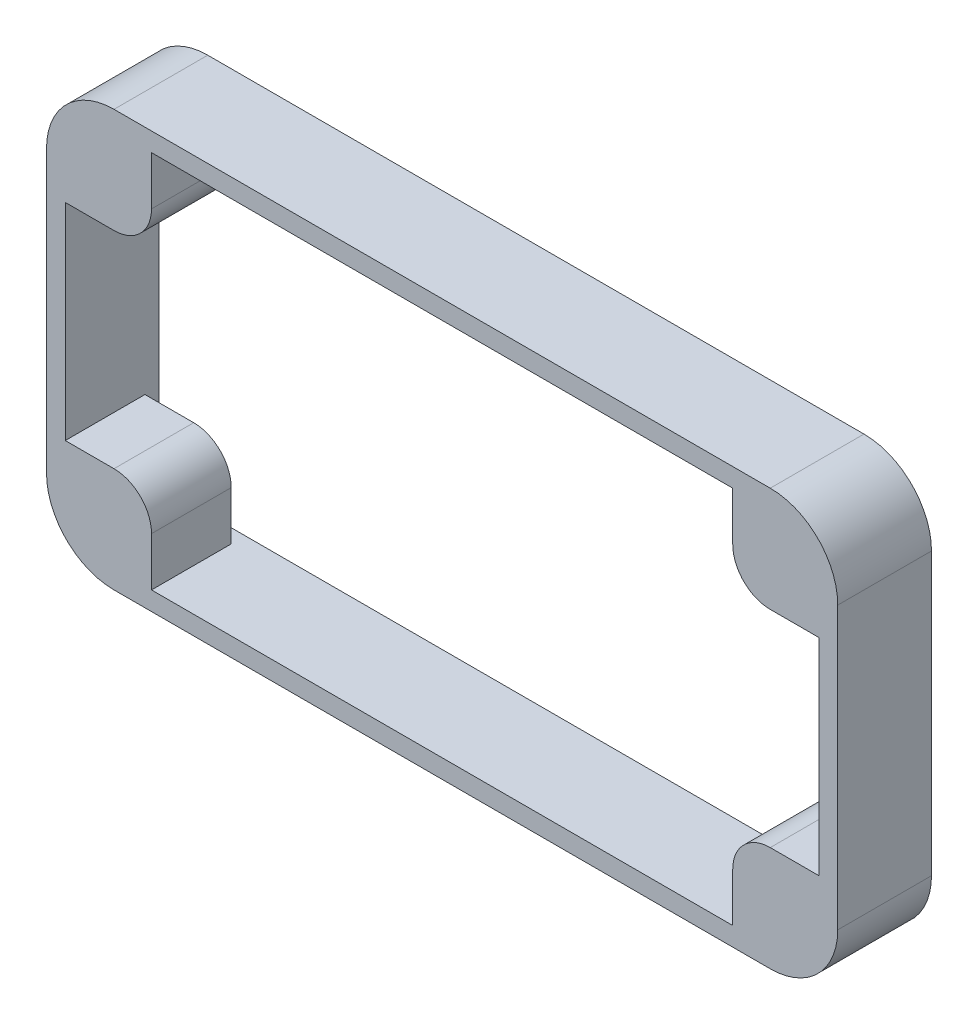
ISO-10303-21;
HEADER;
FILE_DESCRIPTION(('STEP AP214'),'2;1');
FILE_NAME('part.step','',(''),(''),'','','');
FILE_SCHEMA(('AUTOMOTIVE_DESIGN { 1 0 10303 214 1 1 1 1 }'));
ENDSEC;
DATA;
#1=APPLICATION_CONTEXT('core data for automotive mechanical design processes');
#2=APPLICATION_PROTOCOL_DEFINITION('international standard','automotive_design',2000,#1);
#3=PRODUCT_CONTEXT('',#1,'mechanical');
#4=PRODUCT('Part','Part','',(#3));
#5=PRODUCT_RELATED_PRODUCT_CATEGORY('part','',(#4));
#6=PRODUCT_DEFINITION_FORMATION('','',#4);
#7=PRODUCT_DEFINITION_CONTEXT('part definition',#1,'design');
#8=PRODUCT_DEFINITION('design','',#6,#7);
#9=PRODUCT_DEFINITION_SHAPE('','',#8);
#10=(LENGTH_UNIT() NAMED_UNIT(*) SI_UNIT(.MILLI.,.METRE.));
#11=(NAMED_UNIT(*) PLANE_ANGLE_UNIT() SI_UNIT($,.RADIAN.));
#12=(NAMED_UNIT(*) SI_UNIT($,.STERADIAN.) SOLID_ANGLE_UNIT());
#13=UNCERTAINTY_MEASURE_WITH_UNIT(LENGTH_MEASURE(1.E-05),#10,'distance_accuracy_value','');
#14=(GEOMETRIC_REPRESENTATION_CONTEXT(3) GLOBAL_UNCERTAINTY_ASSIGNED_CONTEXT((#13)) GLOBAL_UNIT_ASSIGNED_CONTEXT((#10,
#11,#12)) REPRESENTATION_CONTEXT('',''));
#15=CARTESIAN_POINT('',(0.,0.,0.));
#16=DIRECTION('',(0.,0.,1.));
#17=DIRECTION('',(1.,0.,0.));
#18=AXIS2_PLACEMENT_3D('',#15,#16,#17);
#19=CARTESIAN_POINT('',(-35.,-15.,10.));
#20=DIRECTION('',(0.,0.,-1.));
#21=DIRECTION('',(-1.,0.,0.));
#22=AXIS2_PLACEMENT_3D('',#19,#20,#21);
#23=CYLINDRICAL_SURFACE('',#22,5.20000000000001);
#24=DIRECTION('',(0.,0.,-1.));
#25=VECTOR('',#24,1.);
#26=CARTESIAN_POINT('',(-40.2,-15.,10.));
#27=LINE('',#26,#25);
#28=CARTESIAN_POINT('',(-40.2,-15.,1.5));
#29=VERTEX_POINT('',#28);
#30=CARTESIAN_POINT('',(-40.2,-15.,0.));
#31=VERTEX_POINT('',#30);
#32=EDGE_CURVE('E323',#29,#31,#27,.T.);
#33=ORIENTED_EDGE('',*,*,#32,.F.);
#34=CARTESIAN_POINT('',(-35.,-15.,1.5));
#35=DIRECTION('',(0.,0.,-1.));
#36=DIRECTION('',(1.,0.,0.));
#37=AXIS2_PLACEMENT_3D('',#34,#35,#36);
#38=CIRCLE('',#37,5.2);
#39=CARTESIAN_POINT('',(-35.,-20.2,1.5));
#40=VERTEX_POINT('',#39);
#41=EDGE_CURVE('E870',#40,#29,#38,.T.);
#42=ORIENTED_EDGE('',*,*,#41,.F.);
#43=DIRECTION('',(0.,0.,-1.));
#44=VECTOR('',#43,1.);
#45=CARTESIAN_POINT('',(-35.,-20.2,10.));
#46=LINE('',#45,#44);
#47=CARTESIAN_POINT('',(-35.,-20.2,0.));
#48=VERTEX_POINT('',#47);
#49=EDGE_CURVE('E321',#40,#48,#46,.T.);
#50=ORIENTED_EDGE('',*,*,#49,.T.);
#51=CARTESIAN_POINT('',(-35.,-15.,0.));
#52=DIRECTION('',(0.,0.,1.));
#53=DIRECTION('',(-1.,0.,0.));
#54=AXIS2_PLACEMENT_3D('',#51,#52,#53);
#55=CIRCLE('',#54,5.20000000000001);
#56=EDGE_CURVE('E298',#31,#48,#55,.T.);
#57=ORIENTED_EDGE('',*,*,#56,.F.);
#58=EDGE_LOOP('',(#33,#42,#50,#57));
#59=FACE_BOUND('',#58,.T.);
#60=ADVANCED_FACE('F35',(#59),#23,.F.);
#61=CARTESIAN_POINT('',(35.,-15.,10.));
#62=DIRECTION('',(0.,0.,-1.));
#63=DIRECTION('',(-1.,0.,0.));
#64=AXIS2_PLACEMENT_3D('',#61,#62,#63);
#65=CYLINDRICAL_SURFACE('',#64,5.2);
#66=DIRECTION('',(0.,0.,-1.));
#67=VECTOR('',#66,1.);
#68=CARTESIAN_POINT('',(35.,-20.2,10.));
#69=LINE('',#68,#67);
#70=CARTESIAN_POINT('',(35.,-20.2,1.5));
#71=VERTEX_POINT('',#70);
#72=CARTESIAN_POINT('',(35.,-20.2,0.));
#73=VERTEX_POINT('',#72);
#74=EDGE_CURVE('E319',#71,#73,#69,.T.);
#75=ORIENTED_EDGE('',*,*,#74,.F.);
#76=CARTESIAN_POINT('',(35.,-15.,1.5));
#77=DIRECTION('',(0.,0.,-1.));
#78=DIRECTION('',(-1.,0.,0.));
#79=AXIS2_PLACEMENT_3D('',#76,#77,#78);
#80=CIRCLE('',#79,5.2);
#81=CARTESIAN_POINT('',(40.2,-15.,1.5));
#82=VERTEX_POINT('',#81);
#83=EDGE_CURVE('E845',#82,#71,#80,.T.);
#84=ORIENTED_EDGE('',*,*,#83,.F.);
#85=DIRECTION('',(0.,0.,-1.));
#86=VECTOR('',#85,1.);
#87=CARTESIAN_POINT('',(40.2,-15.,10.));
#88=LINE('',#87,#86);
#89=CARTESIAN_POINT('',(40.2,-15.,0.));
#90=VERTEX_POINT('',#89);
#91=EDGE_CURVE('E317',#82,#90,#88,.T.);
#92=ORIENTED_EDGE('',*,*,#91,.T.);
#93=CARTESIAN_POINT('',(35.,-15.,0.));
#94=DIRECTION('',(0.,0.,1.));
#95=DIRECTION('',(-1.,0.,0.));
#96=AXIS2_PLACEMENT_3D('',#93,#94,#95);
#97=CIRCLE('',#96,5.2);
#98=EDGE_CURVE('E304',#73,#90,#97,.T.);
#99=ORIENTED_EDGE('',*,*,#98,.F.);
#100=EDGE_LOOP('',(#75,#84,#92,#99));
#101=FACE_BOUND('',#100,.T.);
#102=ADVANCED_FACE('F428',(#101),#65,.F.);
#103=CARTESIAN_POINT('',(35.,15.,10.));
#104=DIRECTION('',(0.,0.,-1.));
#105=DIRECTION('',(-1.,0.,0.));
#106=AXIS2_PLACEMENT_3D('',#103,#104,#105);
#107=CYLINDRICAL_SURFACE('',#106,5.2);
#108=DIRECTION('',(0.,0.,-1.));
#109=VECTOR('',#108,1.);
#110=CARTESIAN_POINT('',(40.2,15.,10.));
#111=LINE('',#110,#109);
#112=CARTESIAN_POINT('',(40.2,15.,1.5));
#113=VERTEX_POINT('',#112);
#114=CARTESIAN_POINT('',(40.2,15.,0.));
#115=VERTEX_POINT('',#114);
#116=EDGE_CURVE('E315',#113,#115,#111,.T.);
#117=ORIENTED_EDGE('',*,*,#116,.F.);
#118=CARTESIAN_POINT('',(35.,15.,1.5));
#119=DIRECTION('',(0.,0.,-1.));
#120=DIRECTION('',(1.,0.,0.));
#121=AXIS2_PLACEMENT_3D('',#118,#119,#120);
#122=CIRCLE('',#121,5.2);
#123=CARTESIAN_POINT('',(35.,20.2,1.5));
#124=VERTEX_POINT('',#123);
#125=EDGE_CURVE('E746',#124,#113,#122,.T.);
#126=ORIENTED_EDGE('',*,*,#125,.F.);
#127=DIRECTION('',(0.,0.,-1.));
#128=VECTOR('',#127,1.);
#129=CARTESIAN_POINT('',(35.,20.2,10.));
#130=LINE('',#129,#128);
#131=CARTESIAN_POINT('',(35.,20.2,0.));
#132=VERTEX_POINT('',#131);
#133=EDGE_CURVE('E313',#124,#132,#130,.T.);
#134=ORIENTED_EDGE('',*,*,#133,.T.);
#135=CARTESIAN_POINT('',(35.,15.,0.));
#136=DIRECTION('',(0.,0.,1.));
#137=DIRECTION('',(-1.,0.,0.));
#138=AXIS2_PLACEMENT_3D('',#135,#136,#137);
#139=CIRCLE('',#138,5.2);
#140=EDGE_CURVE('E281',#115,#132,#139,.T.);
#141=ORIENTED_EDGE('',*,*,#140,.F.);
#142=EDGE_LOOP('',(#117,#126,#134,#141));
#143=FACE_BOUND('',#142,.T.);
#144=ADVANCED_FACE('F434',(#143),#107,.F.);
#145=CARTESIAN_POINT('',(-35.,15.,10.));
#146=DIRECTION('',(0.,0.,-1.));
#147=DIRECTION('',(-1.,0.,0.));
#148=AXIS2_PLACEMENT_3D('',#145,#146,#147);
#149=CYLINDRICAL_SURFACE('',#148,5.2);
#150=DIRECTION('',(0.,0.,-1.));
#151=VECTOR('',#150,1.);
#152=CARTESIAN_POINT('',(-35.,20.2,10.));
#153=LINE('',#152,#151);
#154=CARTESIAN_POINT('',(-35.,20.2,1.5));
#155=VERTEX_POINT('',#154);
#156=CARTESIAN_POINT('',(-35.,20.2,0.));
#157=VERTEX_POINT('',#156);
#158=EDGE_CURVE('E290',#155,#157,#153,.T.);
#159=ORIENTED_EDGE('',*,*,#158,.F.);
#160=CARTESIAN_POINT('',(-35.,15.,1.5));
#161=DIRECTION('',(0.,0.,-1.));
#162=DIRECTION('',(-1.,0.,0.));
#163=AXIS2_PLACEMENT_3D('',#160,#161,#162);
#164=CIRCLE('',#163,5.2);
#165=CARTESIAN_POINT('',(-40.2,15.,1.5));
#166=VERTEX_POINT('',#165);
#167=EDGE_CURVE('E799',#166,#155,#164,.T.);
#168=ORIENTED_EDGE('',*,*,#167,.F.);
#169=DIRECTION('',(0.,0.,-1.));
#170=VECTOR('',#169,1.);
#171=CARTESIAN_POINT('',(-40.2,15.,10.));
#172=LINE('',#171,#170);
#173=CARTESIAN_POINT('',(-40.2,15.,0.));
#174=VERTEX_POINT('',#173);
#175=EDGE_CURVE('E325',#166,#174,#172,.T.);
#176=ORIENTED_EDGE('',*,*,#175,.T.);
#177=CARTESIAN_POINT('',(-35.,15.,0.));
#178=DIRECTION('',(0.,0.,1.));
#179=DIRECTION('',(1.,0.,0.));
#180=AXIS2_PLACEMENT_3D('',#177,#178,#179);
#181=CIRCLE('',#180,5.2);
#182=EDGE_CURVE('E291',#157,#174,#181,.T.);
#183=ORIENTED_EDGE('',*,*,#182,.F.);
#184=EDGE_LOOP('',(#159,#168,#176,#183));
#185=FACE_BOUND('',#184,.T.);
#186=ADVANCED_FACE('F443',(#185),#149,.F.);
#187=CARTESIAN_POINT('',(-35.,15.,10.));
#188=DIRECTION('',(0.,0.,1.));
#189=DIRECTION('',(1.,0.,0.));
#190=AXIS2_PLACEMENT_3D('',#187,#188,#189);
#191=PLANE('',#190);
#192=DIRECTION('',(1.,0.,0.));
#193=VECTOR('',#192,1.);
#194=CARTESIAN_POINT('',(-35.,-11.,10.));
#195=LINE('',#194,#193);
#196=CARTESIAN_POINT('',(-40.2,-11.,10.));
#197=VERTEX_POINT('',#196);
#198=CARTESIAN_POINT('',(-35.,-11.,10.));
#199=VERTEX_POINT('',#198);
#200=EDGE_CURVE('E249',#197,#199,#195,.T.);
#201=ORIENTED_EDGE('',*,*,#200,.F.);
#202=DIRECTION('',(0.,-1.,0.));
#203=VECTOR('',#202,1.);
#204=CARTESIAN_POINT('',(-40.2,-15.,10.));
#205=LINE('',#204,#203);
#206=CARTESIAN_POINT('',(-40.2,11.,10.));
#207=VERTEX_POINT('',#206);
#208=EDGE_CURVE('E265',#207,#197,#205,.T.);
#209=ORIENTED_EDGE('',*,*,#208,.F.);
#210=DIRECTION('',(-1.,0.,0.));
#211=VECTOR('',#210,1.);
#212=CARTESIAN_POINT('',(-35.,11.,10.));
#213=LINE('',#212,#211);
#214=CARTESIAN_POINT('',(-35.,11.,10.));
#215=VERTEX_POINT('',#214);
#216=EDGE_CURVE('E786',#215,#207,#213,.T.);
#217=ORIENTED_EDGE('',*,*,#216,.F.);
#218=CARTESIAN_POINT('',(-35.,15.,10.));
#219=DIRECTION('',(0.,0.,-1.));
#220=DIRECTION('',(1.,0.,0.));
#221=AXIS2_PLACEMENT_3D('',#218,#219,#220);
#222=CIRCLE('',#221,4.);
#223=CARTESIAN_POINT('',(-31.,15.,10.));
#224=VERTEX_POINT('',#223);
#225=EDGE_CURVE('E783',#224,#215,#222,.T.);
#226=ORIENTED_EDGE('',*,*,#225,.F.);
#227=DIRECTION('',(0.,-1.,0.));
#228=VECTOR('',#227,1.);
#229=CARTESIAN_POINT('',(-31.,15.,10.));
#230=LINE('',#229,#228);
#231=CARTESIAN_POINT('',(-31.,20.2,10.));
#232=VERTEX_POINT('',#231);
#233=EDGE_CURVE('E789',#232,#224,#230,.T.);
#234=ORIENTED_EDGE('',*,*,#233,.F.);
#235=DIRECTION('',(-1.,0.,0.));
#236=VECTOR('',#235,1.);
#237=CARTESIAN_POINT('',(-35.,20.2,10.));
#238=LINE('',#237,#236);
#239=CARTESIAN_POINT('',(31.,20.2,10.));
#240=VERTEX_POINT('',#239);
#241=EDGE_CURVE('E288',#240,#232,#238,.T.);
#242=ORIENTED_EDGE('',*,*,#241,.F.);
#243=DIRECTION('',(0.,1.,0.));
#244=VECTOR('',#243,1.);
#245=CARTESIAN_POINT('',(31.,15.,10.));
#246=LINE('',#245,#244);
#247=CARTESIAN_POINT('',(31.,15.,10.));
#248=VERTEX_POINT('',#247);
#249=EDGE_CURVE('E782',#248,#240,#246,.T.);
#250=ORIENTED_EDGE('',*,*,#249,.F.);
#251=CARTESIAN_POINT('',(35.,15.,10.));
#252=DIRECTION('',(0.,0.,-1.));
#253=DIRECTION('',(-1.,0.,0.));
#254=AXIS2_PLACEMENT_3D('',#251,#252,#253);
#255=CIRCLE('',#254,4.);
#256=CARTESIAN_POINT('',(35.,11.,10.));
#257=VERTEX_POINT('',#256);
#258=EDGE_CURVE('E823',#257,#248,#255,.T.);
#259=ORIENTED_EDGE('',*,*,#258,.F.);
#260=DIRECTION('',(-1.,0.,0.));
#261=VECTOR('',#260,1.);
#262=CARTESIAN_POINT('',(35.,11.,10.));
#263=LINE('',#262,#261);
#264=CARTESIAN_POINT('',(40.2,11.,10.));
#265=VERTEX_POINT('',#264);
#266=EDGE_CURVE('E772',#265,#257,#263,.T.);
#267=ORIENTED_EDGE('',*,*,#266,.F.);
#268=DIRECTION('',(0.,1.,0.));
#269=VECTOR('',#268,1.);
#270=CARTESIAN_POINT('',(40.2,15.,10.));
#271=LINE('',#270,#269);
#272=CARTESIAN_POINT('',(40.2,-11.,10.));
#273=VERTEX_POINT('',#272);
#274=EDGE_CURVE('E278',#273,#265,#271,.T.);
#275=ORIENTED_EDGE('',*,*,#274,.F.);
#276=DIRECTION('',(1.,0.,0.));
#277=VECTOR('',#276,1.);
#278=CARTESIAN_POINT('',(35.,-11.,10.));
#279=LINE('',#278,#277);
#280=CARTESIAN_POINT('',(35.,-11.,10.));
#281=VERTEX_POINT('',#280);
#282=EDGE_CURVE('E855',#281,#273,#279,.T.);
#283=ORIENTED_EDGE('',*,*,#282,.F.);
#284=CARTESIAN_POINT('',(35.,-15.,10.));
#285=DIRECTION('',(0.,0.,-1.));
#286=DIRECTION('',(1.,0.,0.));
#287=AXIS2_PLACEMENT_3D('',#284,#285,#286);
#288=CIRCLE('',#287,4.);
#289=CARTESIAN_POINT('',(31.,-15.,10.));
#290=VERTEX_POINT('',#289);
#291=EDGE_CURVE('E842',#290,#281,#288,.T.);
#292=ORIENTED_EDGE('',*,*,#291,.F.);
#293=DIRECTION('',(0.,1.,0.));
#294=VECTOR('',#293,1.);
#295=CARTESIAN_POINT('',(31.,-15.,10.));
#296=LINE('',#295,#294);
#297=CARTESIAN_POINT('',(31.,-20.2,10.));
#298=VERTEX_POINT('',#297);
#299=EDGE_CURVE('E833',#298,#290,#296,.T.);
#300=ORIENTED_EDGE('',*,*,#299,.F.);
#301=DIRECTION('',(1.,0.,0.));
#302=VECTOR('',#301,1.);
#303=CARTESIAN_POINT('',(35.,-20.2,10.));
#304=LINE('',#303,#302);
#305=CARTESIAN_POINT('',(-31.,-20.2,10.));
#306=VERTEX_POINT('',#305);
#307=EDGE_CURVE('E275',#306,#298,#304,.T.);
#308=ORIENTED_EDGE('',*,*,#307,.F.);
#309=DIRECTION('',(0.,-1.,0.));
#310=VECTOR('',#309,1.);
#311=CARTESIAN_POINT('',(-31.,-15.,10.));
#312=LINE('',#311,#310);
#313=CARTESIAN_POINT('',(-31.,-15.,10.));
#314=VERTEX_POINT('',#313);
#315=EDGE_CURVE('E257',#314,#306,#312,.T.);
#316=ORIENTED_EDGE('',*,*,#315,.F.);
#317=CARTESIAN_POINT('',(-35.,-15.,10.));
#318=DIRECTION('',(0.,0.,-1.));
#319=DIRECTION('',(-1.,0.,0.));
#320=AXIS2_PLACEMENT_3D('',#317,#318,#319);
#321=CIRCLE('',#320,3.99999999999999);
#322=EDGE_CURVE('E268',#199,#314,#321,.T.);
#323=ORIENTED_EDGE('',*,*,#322,.F.);
#324=EDGE_LOOP('',(#201,#209,#217,#226,#234,#242,#250,#259,#267,#275,#283,#292,#300,#308,#316,#323));
#325=FACE_BOUND('',#324,.T.);
#326=CARTESIAN_POINT('',(-35.,15.,10.));
#327=DIRECTION('',(0.,0.,1.));
#328=DIRECTION('',(1.,0.,0.));
#329=AXIS2_PLACEMENT_3D('',#326,#327,#328);
#330=CIRCLE('',#329,7.2);
#331=CARTESIAN_POINT('',(-35.,22.2,10.));
#332=VERTEX_POINT('',#331);
#333=CARTESIAN_POINT('',(-42.2,15.,10.));
#334=VERTEX_POINT('',#333);
#335=EDGE_CURVE('E328',#332,#334,#330,.T.);
#336=ORIENTED_EDGE('',*,*,#335,.T.);
#337=DIRECTION('',(0.,-1.,0.));
#338=VECTOR('',#337,1.);
#339=CARTESIAN_POINT('',(-42.2,-15.,10.));
#340=LINE('',#339,#338);
#341=CARTESIAN_POINT('',(-42.2,-15.,10.));
#342=VERTEX_POINT('',#341);
#343=EDGE_CURVE('E331',#334,#342,#340,.T.);
#344=ORIENTED_EDGE('',*,*,#343,.T.);
#345=CARTESIAN_POINT('',(-35.,-15.,10.));
#346=DIRECTION('',(0.,0.,1.));
#347=DIRECTION('',(-1.,0.,0.));
#348=AXIS2_PLACEMENT_3D('',#345,#346,#347);
#349=CIRCLE('',#348,7.20000000000001);
#350=CARTESIAN_POINT('',(-35.,-22.2,10.));
#351=VERTEX_POINT('',#350);
#352=EDGE_CURVE('E334',#342,#351,#349,.T.);
#353=ORIENTED_EDGE('',*,*,#352,.T.);
#354=DIRECTION('',(1.,0.,0.));
#355=VECTOR('',#354,1.);
#356=CARTESIAN_POINT('',(35.,-22.2,10.));
#357=LINE('',#356,#355);
#358=CARTESIAN_POINT('',(35.,-22.2,10.));
#359=VERTEX_POINT('',#358);
#360=EDGE_CURVE('E336',#351,#359,#357,.T.);
#361=ORIENTED_EDGE('',*,*,#360,.T.);
#362=CARTESIAN_POINT('',(35.,-15.,10.));
#363=DIRECTION('',(0.,0.,1.));
#364=DIRECTION('',(-1.,0.,0.));
#365=AXIS2_PLACEMENT_3D('',#362,#363,#364);
#366=CIRCLE('',#365,7.20000000000001);
#367=CARTESIAN_POINT('',(42.2,-15.,10.));
#368=VERTEX_POINT('',#367);
#369=EDGE_CURVE('E338',#359,#368,#366,.T.);
#370=ORIENTED_EDGE('',*,*,#369,.T.);
#371=DIRECTION('',(0.,1.,0.));
#372=VECTOR('',#371,1.);
#373=CARTESIAN_POINT('',(42.2,15.,10.));
#374=LINE('',#373,#372);
#375=CARTESIAN_POINT('',(42.2,15.,10.));
#376=VERTEX_POINT('',#375);
#377=EDGE_CURVE('E340',#368,#376,#374,.T.);
#378=ORIENTED_EDGE('',*,*,#377,.T.);
#379=CARTESIAN_POINT('',(35.,15.,10.));
#380=DIRECTION('',(0.,0.,1.));
#381=DIRECTION('',(-1.,0.,0.));
#382=AXIS2_PLACEMENT_3D('',#379,#380,#381);
#383=CIRCLE('',#382,7.2);
#384=CARTESIAN_POINT('',(35.,22.2,10.));
#385=VERTEX_POINT('',#384);
#386=EDGE_CURVE('E342',#376,#385,#383,.T.);
#387=ORIENTED_EDGE('',*,*,#386,.T.);
#388=DIRECTION('',(-1.,0.,0.));
#389=VECTOR('',#388,1.);
#390=CARTESIAN_POINT('',(-35.,22.2,10.));
#391=LINE('',#390,#389);
#392=EDGE_CURVE('E344',#385,#332,#391,.T.);
#393=ORIENTED_EDGE('',*,*,#392,.T.);
#394=EDGE_LOOP('',(#336,#344,#353,#361,#370,#378,#387,#393));
#395=FACE_BOUND('',#394,.T.);
#396=ADVANCED_FACE('F262',(#325,#395),#191,.T.);
#397=CARTESIAN_POINT('',(-35.,15.,0.));
#398=DIRECTION('',(0.,0.,1.));
#399=DIRECTION('',(1.,0.,0.));
#400=AXIS2_PLACEMENT_3D('',#397,#398,#399);
#401=PLANE('',#400);
#402=CARTESIAN_POINT('',(-35.,15.,0.));
#403=DIRECTION('',(0.,0.,1.));
#404=DIRECTION('',(1.,0.,0.));
#405=AXIS2_PLACEMENT_3D('',#402,#403,#404);
#406=CIRCLE('',#405,7.2);
#407=CARTESIAN_POINT('',(-35.,22.2,0.));
#408=VERTEX_POINT('',#407);
#409=CARTESIAN_POINT('',(-42.2,15.,0.));
#410=VERTEX_POINT('',#409);
#411=EDGE_CURVE('E327',#408,#410,#406,.T.);
#412=ORIENTED_EDGE('',*,*,#411,.F.);
#413=DIRECTION('',(-1.,0.,0.));
#414=VECTOR('',#413,1.);
#415=CARTESIAN_POINT('',(-35.,22.2,0.));
#416=LINE('',#415,#414);
#417=CARTESIAN_POINT('',(35.,22.2,0.));
#418=VERTEX_POINT('',#417);
#419=EDGE_CURVE('E332',#418,#408,#416,.T.);
#420=ORIENTED_EDGE('',*,*,#419,.F.);
#421=CARTESIAN_POINT('',(35.,15.,0.));
#422=DIRECTION('',(0.,0.,1.));
#423=DIRECTION('',(-1.,0.,0.));
#424=AXIS2_PLACEMENT_3D('',#421,#422,#423);
#425=CIRCLE('',#424,7.2);
#426=CARTESIAN_POINT('',(42.2,15.,0.));
#427=VERTEX_POINT('',#426);
#428=EDGE_CURVE('E359',#427,#418,#425,.T.);
#429=ORIENTED_EDGE('',*,*,#428,.F.);
#430=DIRECTION('',(0.,1.,0.));
#431=VECTOR('',#430,1.);
#432=CARTESIAN_POINT('',(42.2,15.,0.));
#433=LINE('',#432,#431);
#434=CARTESIAN_POINT('',(42.2,-15.,0.));
#435=VERTEX_POINT('',#434);
#436=EDGE_CURVE('E357',#435,#427,#433,.T.);
#437=ORIENTED_EDGE('',*,*,#436,.F.);
#438=CARTESIAN_POINT('',(35.,-15.,0.));
#439=DIRECTION('',(0.,0.,1.));
#440=DIRECTION('',(-1.,0.,0.));
#441=AXIS2_PLACEMENT_3D('',#438,#439,#440);
#442=CIRCLE('',#441,7.20000000000001);
#443=CARTESIAN_POINT('',(35.,-22.2,0.));
#444=VERTEX_POINT('',#443);
#445=EDGE_CURVE('E355',#444,#435,#442,.T.);
#446=ORIENTED_EDGE('',*,*,#445,.F.);
#447=DIRECTION('',(1.,0.,0.));
#448=VECTOR('',#447,1.);
#449=CARTESIAN_POINT('',(35.,-22.2,0.));
#450=LINE('',#449,#448);
#451=CARTESIAN_POINT('',(-35.,-22.2,0.));
#452=VERTEX_POINT('',#451);
#453=EDGE_CURVE('E353',#452,#444,#450,.T.);
#454=ORIENTED_EDGE('',*,*,#453,.F.);
#455=CARTESIAN_POINT('',(-35.,-15.,0.));
#456=DIRECTION('',(0.,0.,1.));
#457=DIRECTION('',(-1.,0.,0.));
#458=AXIS2_PLACEMENT_3D('',#455,#456,#457);
#459=CIRCLE('',#458,7.20000000000001);
#460=CARTESIAN_POINT('',(-42.2,-15.,0.));
#461=VERTEX_POINT('',#460);
#462=EDGE_CURVE('E351',#461,#452,#459,.T.);
#463=ORIENTED_EDGE('',*,*,#462,.F.);
#464=DIRECTION('',(0.,-1.,0.));
#465=VECTOR('',#464,1.);
#466=CARTESIAN_POINT('',(-42.2,-15.,0.));
#467=LINE('',#466,#465);
#468=EDGE_CURVE('E349',#410,#461,#467,.T.);
#469=ORIENTED_EDGE('',*,*,#468,.F.);
#470=EDGE_LOOP('',(#412,#420,#429,#437,#446,#454,#463,#469));
#471=FACE_BOUND('',#470,.T.);
#472=ORIENTED_EDGE('',*,*,#182,.T.);
#473=DIRECTION('',(0.,-1.,0.));
#474=VECTOR('',#473,1.);
#475=CARTESIAN_POINT('',(-40.2,-15.,0.));
#476=LINE('',#475,#474);
#477=EDGE_CURVE('E294',#174,#31,#476,.T.);
#478=ORIENTED_EDGE('',*,*,#477,.T.);
#479=ORIENTED_EDGE('',*,*,#56,.T.);
#480=DIRECTION('',(1.,0.,0.));
#481=VECTOR('',#480,1.);
#482=CARTESIAN_POINT('',(35.,-20.2,0.));
#483=LINE('',#482,#481);
#484=EDGE_CURVE('E301',#48,#73,#483,.T.);
#485=ORIENTED_EDGE('',*,*,#484,.T.);
#486=ORIENTED_EDGE('',*,*,#98,.T.);
#487=DIRECTION('',(0.,1.,0.));
#488=VECTOR('',#487,1.);
#489=CARTESIAN_POINT('',(40.2,15.,0.));
#490=LINE('',#489,#488);
#491=EDGE_CURVE('E307',#90,#115,#490,.T.);
#492=ORIENTED_EDGE('',*,*,#491,.T.);
#493=ORIENTED_EDGE('',*,*,#140,.T.);
#494=DIRECTION('',(-1.,0.,0.));
#495=VECTOR('',#494,1.);
#496=CARTESIAN_POINT('',(-35.,20.2,0.));
#497=LINE('',#496,#495);
#498=EDGE_CURVE('E276',#132,#157,#497,.T.);
#499=ORIENTED_EDGE('',*,*,#498,.T.);
#500=EDGE_LOOP('',(#472,#478,#479,#485,#486,#492,#493,#499));
#501=FACE_BOUND('',#500,.T.);
#502=ADVANCED_FACE('F389',(#471,#501),#401,.F.);
#503=CARTESIAN_POINT('',(-35.,15.,10.));
#504=DIRECTION('',(0.,0.,-1.));
#505=DIRECTION('',(-1.,0.,0.));
#506=AXIS2_PLACEMENT_3D('',#503,#504,#505);
#507=CYLINDRICAL_SURFACE('',#506,7.2);
#508=ORIENTED_EDGE('',*,*,#411,.T.);
#509=DIRECTION('',(0.,0.,-1.));
#510=VECTOR('',#509,1.);
#511=CARTESIAN_POINT('',(-42.2,15.,10.));
#512=LINE('',#511,#510);
#513=EDGE_CURVE('E11',#334,#410,#512,.T.);
#514=ORIENTED_EDGE('',*,*,#513,.F.);
#515=ORIENTED_EDGE('',*,*,#335,.F.);
#516=DIRECTION('',(0.,0.,-1.));
#517=VECTOR('',#516,1.);
#518=CARTESIAN_POINT('',(-35.,22.2,10.));
#519=LINE('',#518,#517);
#520=EDGE_CURVE('E346',#332,#408,#519,.T.);
#521=ORIENTED_EDGE('',*,*,#520,.T.);
#522=EDGE_LOOP('',(#508,#514,#515,#521));
#523=FACE_BOUND('',#522,.T.);
#524=ADVANCED_FACE('F37',(#523),#507,.T.);
#525=CARTESIAN_POINT('',(-42.2,-15.,10.));
#526=DIRECTION('',(1.,0.,0.));
#527=DIRECTION('',(0.,1.,0.));
#528=AXIS2_PLACEMENT_3D('',#525,#526,#527);
#529=PLANE('',#528);
#530=ORIENTED_EDGE('',*,*,#468,.T.);
#531=DIRECTION('',(0.,0.,-1.));
#532=VECTOR('',#531,1.);
#533=CARTESIAN_POINT('',(-42.2,-15.,10.));
#534=LINE('',#533,#532);
#535=EDGE_CURVE('E43',#342,#461,#534,.T.);
#536=ORIENTED_EDGE('',*,*,#535,.F.);
#537=ORIENTED_EDGE('',*,*,#343,.F.);
#538=ORIENTED_EDGE('',*,*,#513,.T.);
#539=EDGE_LOOP('',(#530,#536,#537,#538));
#540=FACE_BOUND('',#539,.T.);
#541=ADVANCED_FACE('F405',(#540),#529,.F.);
#542=CARTESIAN_POINT('',(-35.,-15.,10.));
#543=DIRECTION('',(0.,0.,-1.));
#544=DIRECTION('',(-1.,0.,0.));
#545=AXIS2_PLACEMENT_3D('',#542,#543,#544);
#546=CYLINDRICAL_SURFACE('',#545,7.20000000000001);
#547=ORIENTED_EDGE('',*,*,#462,.T.);
#548=DIRECTION('',(0.,0.,-1.));
#549=VECTOR('',#548,1.);
#550=CARTESIAN_POINT('',(-35.,-22.2,10.));
#551=LINE('',#550,#549);
#552=EDGE_CURVE('E376',#351,#452,#551,.T.);
#553=ORIENTED_EDGE('',*,*,#552,.F.);
#554=ORIENTED_EDGE('',*,*,#352,.F.);
#555=ORIENTED_EDGE('',*,*,#535,.T.);
#556=EDGE_LOOP('',(#547,#553,#554,#555));
#557=FACE_BOUND('',#556,.T.);
#558=ADVANCED_FACE('F383',(#557),#546,.T.);
#559=CARTESIAN_POINT('',(35.,-22.2,10.));
#560=DIRECTION('',(0.,1.,0.));
#561=DIRECTION('',(-1.,0.,0.));
#562=AXIS2_PLACEMENT_3D('',#559,#560,#561);
#563=PLANE('',#562);
#564=ORIENTED_EDGE('',*,*,#453,.T.);
#565=DIRECTION('',(0.,0.,-1.));
#566=VECTOR('',#565,1.);
#567=CARTESIAN_POINT('',(35.,-22.2,10.));
#568=LINE('',#567,#566);
#569=EDGE_CURVE('E373',#359,#444,#568,.T.);
#570=ORIENTED_EDGE('',*,*,#569,.F.);
#571=ORIENTED_EDGE('',*,*,#360,.F.);
#572=ORIENTED_EDGE('',*,*,#552,.T.);
#573=EDGE_LOOP('',(#564,#570,#571,#572));
#574=FACE_BOUND('',#573,.T.);
#575=ADVANCED_FACE('F395',(#574),#563,.F.);
#576=CARTESIAN_POINT('',(35.,-15.,10.));
#577=DIRECTION('',(0.,0.,-1.));
#578=DIRECTION('',(-1.,0.,0.));
#579=AXIS2_PLACEMENT_3D('',#576,#577,#578);
#580=CYLINDRICAL_SURFACE('',#579,7.20000000000001);
#581=ORIENTED_EDGE('',*,*,#445,.T.);
#582=DIRECTION('',(0.,0.,-1.));
#583=VECTOR('',#582,1.);
#584=CARTESIAN_POINT('',(42.2,-15.,10.));
#585=LINE('',#584,#583);
#586=EDGE_CURVE('E370',#368,#435,#585,.T.);
#587=ORIENTED_EDGE('',*,*,#586,.F.);
#588=ORIENTED_EDGE('',*,*,#369,.F.);
#589=ORIENTED_EDGE('',*,*,#569,.T.);
#590=EDGE_LOOP('',(#581,#587,#588,#589));
#591=FACE_BOUND('',#590,.T.);
#592=ADVANCED_FACE('F399',(#591),#580,.T.);
#593=CARTESIAN_POINT('',(42.2,15.,10.));
#594=DIRECTION('',(-1.,0.,0.));
#595=DIRECTION('',(0.,-1.,0.));
#596=AXIS2_PLACEMENT_3D('',#593,#594,#595);
#597=PLANE('',#596);
#598=ORIENTED_EDGE('',*,*,#436,.T.);
#599=DIRECTION('',(0.,0.,-1.));
#600=VECTOR('',#599,1.);
#601=CARTESIAN_POINT('',(42.2,15.,10.));
#602=LINE('',#601,#600);
#603=EDGE_CURVE('E367',#376,#427,#602,.T.);
#604=ORIENTED_EDGE('',*,*,#603,.F.);
#605=ORIENTED_EDGE('',*,*,#377,.F.);
#606=ORIENTED_EDGE('',*,*,#586,.T.);
#607=EDGE_LOOP('',(#598,#604,#605,#606));
#608=FACE_BOUND('',#607,.T.);
#609=ADVANCED_FACE('F418',(#608),#597,.F.);
#610=CARTESIAN_POINT('',(35.,15.,10.));
#611=DIRECTION('',(0.,0.,-1.));
#612=DIRECTION('',(-1.,0.,0.));
#613=AXIS2_PLACEMENT_3D('',#610,#611,#612);
#614=CYLINDRICAL_SURFACE('',#613,7.2);
#615=ORIENTED_EDGE('',*,*,#428,.T.);
#616=DIRECTION('',(0.,0.,-1.));
#617=VECTOR('',#616,1.);
#618=CARTESIAN_POINT('',(35.,22.2,10.));
#619=LINE('',#618,#617);
#620=EDGE_CURVE('E364',#385,#418,#619,.T.);
#621=ORIENTED_EDGE('',*,*,#620,.F.);
#622=ORIENTED_EDGE('',*,*,#386,.F.);
#623=ORIENTED_EDGE('',*,*,#603,.T.);
#624=EDGE_LOOP('',(#615,#621,#622,#623));
#625=FACE_BOUND('',#624,.T.);
#626=ADVANCED_FACE('F416',(#625),#614,.T.);
#627=CARTESIAN_POINT('',(-35.,22.2,10.));
#628=DIRECTION('',(0.,-1.,0.));
#629=DIRECTION('',(0.,0.,-1.));
#630=AXIS2_PLACEMENT_3D('',#627,#628,#629);
#631=PLANE('',#630);
#632=ORIENTED_EDGE('',*,*,#419,.T.);
#633=ORIENTED_EDGE('',*,*,#520,.F.);
#634=ORIENTED_EDGE('',*,*,#392,.F.);
#635=ORIENTED_EDGE('',*,*,#620,.T.);
#636=EDGE_LOOP('',(#632,#633,#634,#635));
#637=FACE_BOUND('',#636,.T.);
#638=ADVANCED_FACE('F411',(#637),#631,.F.);
#639=CARTESIAN_POINT('',(-40.2,-15.,10.));
#640=DIRECTION('',(1.,0.,0.));
#641=DIRECTION('',(0.,0.,-1.));
#642=AXIS2_PLACEMENT_3D('',#639,#640,#641);
#643=PLANE('',#642);
#644=DIRECTION('',(0.,0.,-1.));
#645=VECTOR('',#644,1.);
#646=CARTESIAN_POINT('',(-40.2,-11.,10.));
#647=LINE('',#646,#645);
#648=CARTESIAN_POINT('',(-40.2,-11.,1.5));
#649=VERTEX_POINT('',#648);
#650=EDGE_CURVE('E246',#197,#649,#647,.T.);
#651=ORIENTED_EDGE('',*,*,#650,.T.);
#652=DIRECTION('',(0.,1.,0.));
#653=VECTOR('',#652,1.);
#654=CARTESIAN_POINT('',(-40.2,-11.,1.5));
#655=LINE('',#654,#653);
#656=EDGE_CURVE('E868',#29,#649,#655,.T.);
#657=ORIENTED_EDGE('',*,*,#656,.F.);
#658=ORIENTED_EDGE('',*,*,#32,.T.);
#659=ORIENTED_EDGE('',*,*,#477,.F.);
#660=ORIENTED_EDGE('',*,*,#175,.F.);
#661=DIRECTION('',(0.,1.,0.));
#662=VECTOR('',#661,1.);
#663=CARTESIAN_POINT('',(-40.2,11.,1.5));
#664=LINE('',#663,#662);
#665=CARTESIAN_POINT('',(-40.2,11.,1.5));
#666=VERTEX_POINT('',#665);
#667=EDGE_CURVE('E797',#666,#166,#664,.T.);
#668=ORIENTED_EDGE('',*,*,#667,.F.);
#669=DIRECTION('',(0.,0.,-1.));
#670=VECTOR('',#669,1.);
#671=CARTESIAN_POINT('',(-40.2,11.,10.));
#672=LINE('',#671,#670);
#673=EDGE_CURVE('E274',#207,#666,#672,.T.);
#674=ORIENTED_EDGE('',*,*,#673,.F.);
#675=ORIENTED_EDGE('',*,*,#208,.T.);
#676=EDGE_LOOP('',(#651,#657,#658,#659,#660,#668,#674,#675));
#677=FACE_BOUND('',#676,.T.);
#678=ADVANCED_FACE('F272',(#677),#643,.T.);
#679=CARTESIAN_POINT('',(35.,-20.2,10.));
#680=DIRECTION('',(0.,1.,0.));
#681=DIRECTION('',(-1.,0.,0.));
#682=AXIS2_PLACEMENT_3D('',#679,#680,#681);
#683=PLANE('',#682);
#684=DIRECTION('',(0.,0.,-1.));
#685=VECTOR('',#684,1.);
#686=CARTESIAN_POINT('',(-31.,-20.2,10.));
#687=LINE('',#686,#685);
#688=CARTESIAN_POINT('',(-31.,-20.2,1.5));
#689=VERTEX_POINT('',#688);
#690=EDGE_CURVE('E852',#306,#689,#687,.T.);
#691=ORIENTED_EDGE('',*,*,#690,.F.);
#692=ORIENTED_EDGE('',*,*,#307,.T.);
#693=DIRECTION('',(0.,0.,-1.));
#694=VECTOR('',#693,1.);
#695=CARTESIAN_POINT('',(31.,-20.2,10.));
#696=LINE('',#695,#694);
#697=CARTESIAN_POINT('',(31.,-20.2,1.5));
#698=VERTEX_POINT('',#697);
#699=EDGE_CURVE('E835',#298,#698,#696,.T.);
#700=ORIENTED_EDGE('',*,*,#699,.T.);
#701=DIRECTION('',(-1.,0.,0.));
#702=VECTOR('',#701,1.);
#703=CARTESIAN_POINT('',(35.,-20.2,1.5));
#704=LINE('',#703,#702);
#705=EDGE_CURVE('E843',#71,#698,#704,.T.);
#706=ORIENTED_EDGE('',*,*,#705,.F.);
#707=ORIENTED_EDGE('',*,*,#74,.T.);
#708=ORIENTED_EDGE('',*,*,#484,.F.);
#709=ORIENTED_EDGE('',*,*,#49,.F.);
#710=DIRECTION('',(-1.,0.,0.));
#711=VECTOR('',#710,1.);
#712=CARTESIAN_POINT('',(-35.,-20.2,1.5));
#713=LINE('',#712,#711);
#714=EDGE_CURVE('E269',#689,#40,#713,.T.);
#715=ORIENTED_EDGE('',*,*,#714,.F.);
#716=EDGE_LOOP('',(#691,#692,#700,#706,#707,#708,#709,#715));
#717=FACE_BOUND('',#716,.T.);
#718=ADVANCED_FACE('F440',(#717),#683,.T.);
#719=CARTESIAN_POINT('',(40.2,15.,10.));
#720=DIRECTION('',(-1.,0.,0.));
#721=DIRECTION('',(0.,0.,1.));
#722=AXIS2_PLACEMENT_3D('',#719,#720,#721);
#723=PLANE('',#722);
#724=DIRECTION('',(0.,0.,-1.));
#725=VECTOR('',#724,1.);
#726=CARTESIAN_POINT('',(40.2,-11.,10.));
#727=LINE('',#726,#725);
#728=CARTESIAN_POINT('',(40.2,-11.,1.5));
#729=VERTEX_POINT('',#728);
#730=EDGE_CURVE('E832',#273,#729,#727,.T.);
#731=ORIENTED_EDGE('',*,*,#730,.F.);
#732=ORIENTED_EDGE('',*,*,#274,.T.);
#733=DIRECTION('',(0.,0.,-1.));
#734=VECTOR('',#733,1.);
#735=CARTESIAN_POINT('',(40.2,11.,10.));
#736=LINE('',#735,#734);
#737=CARTESIAN_POINT('',(40.2,11.,1.5));
#738=VERTEX_POINT('',#737);
#739=EDGE_CURVE('E756',#265,#738,#736,.T.);
#740=ORIENTED_EDGE('',*,*,#739,.T.);
#741=DIRECTION('',(0.,-1.,0.));
#742=VECTOR('',#741,1.);
#743=CARTESIAN_POINT('',(40.2,11.,1.5));
#744=LINE('',#743,#742);
#745=EDGE_CURVE('E754',#113,#738,#744,.T.);
#746=ORIENTED_EDGE('',*,*,#745,.F.);
#747=ORIENTED_EDGE('',*,*,#116,.T.);
#748=ORIENTED_EDGE('',*,*,#491,.F.);
#749=ORIENTED_EDGE('',*,*,#91,.F.);
#750=DIRECTION('',(0.,-1.,0.));
#751=VECTOR('',#750,1.);
#752=CARTESIAN_POINT('',(40.2,-11.,1.5));
#753=LINE('',#752,#751);
#754=EDGE_CURVE('E847',#729,#82,#753,.T.);
#755=ORIENTED_EDGE('',*,*,#754,.F.);
#756=EDGE_LOOP('',(#731,#732,#740,#746,#747,#748,#749,#755));
#757=FACE_BOUND('',#756,.T.);
#758=ADVANCED_FACE('F467',(#757),#723,.T.);
#759=CARTESIAN_POINT('',(-35.,20.2,10.));
#760=DIRECTION('',(0.,-1.,0.));
#761=DIRECTION('',(0.,0.,-1.));
#762=AXIS2_PLACEMENT_3D('',#759,#760,#761);
#763=PLANE('',#762);
#764=DIRECTION('',(0.,0.,-1.));
#765=VECTOR('',#764,1.);
#766=CARTESIAN_POINT('',(31.,20.2,10.));
#767=LINE('',#766,#765);
#768=CARTESIAN_POINT('',(31.,20.2,1.5));
#769=VERTEX_POINT('',#768);
#770=EDGE_CURVE('E773',#240,#769,#767,.T.);
#771=ORIENTED_EDGE('',*,*,#770,.F.);
#772=ORIENTED_EDGE('',*,*,#241,.T.);
#773=DIRECTION('',(0.,0.,-1.));
#774=VECTOR('',#773,1.);
#775=CARTESIAN_POINT('',(-31.,20.2,10.));
#776=LINE('',#775,#774);
#777=CARTESIAN_POINT('',(-31.,20.2,1.5));
#778=VERTEX_POINT('',#777);
#779=EDGE_CURVE('E806',#232,#778,#776,.T.);
#780=ORIENTED_EDGE('',*,*,#779,.T.);
#781=DIRECTION('',(1.,0.,0.));
#782=VECTOR('',#781,1.);
#783=CARTESIAN_POINT('',(-35.,20.2,1.5));
#784=LINE('',#783,#782);
#785=EDGE_CURVE('E801',#155,#778,#784,.T.);
#786=ORIENTED_EDGE('',*,*,#785,.F.);
#787=ORIENTED_EDGE('',*,*,#158,.T.);
#788=ORIENTED_EDGE('',*,*,#498,.F.);
#789=ORIENTED_EDGE('',*,*,#133,.F.);
#790=DIRECTION('',(1.,0.,0.));
#791=VECTOR('',#790,1.);
#792=CARTESIAN_POINT('',(35.,20.2,1.5));
#793=LINE('',#792,#791);
#794=EDGE_CURVE('E770',#769,#124,#793,.T.);
#795=ORIENTED_EDGE('',*,*,#794,.F.);
#796=EDGE_LOOP('',(#771,#772,#780,#786,#787,#788,#789,#795));
#797=FACE_BOUND('',#796,.T.);
#798=ADVANCED_FACE('F474',(#797),#763,.T.);
#799=CARTESIAN_POINT('',(-35.,15.,10.));
#800=DIRECTION('',(0.,0.,-1.));
#801=DIRECTION('',(-1.,0.,0.));
#802=AXIS2_PLACEMENT_3D('',#799,#800,#801);
#803=CYLINDRICAL_SURFACE('',#802,4.);
#804=CARTESIAN_POINT('',(-35.,15.,1.5));
#805=DIRECTION('',(0.,0.,-1.));
#806=DIRECTION('',(1.,0.,0.));
#807=AXIS2_PLACEMENT_3D('',#804,#805,#806);
#808=CIRCLE('',#807,4.);
#809=CARTESIAN_POINT('',(-31.,15.,1.5));
#810=VERTEX_POINT('',#809);
#811=CARTESIAN_POINT('',(-35.,11.,1.5));
#812=VERTEX_POINT('',#811);
#813=EDGE_CURVE('E776',#810,#812,#808,.T.);
#814=ORIENTED_EDGE('',*,*,#813,.F.);
#815=DIRECTION('',(0.,0.,-1.));
#816=VECTOR('',#815,1.);
#817=CARTESIAN_POINT('',(-31.,15.,10.));
#818=LINE('',#817,#816);
#819=EDGE_CURVE('E295',#224,#810,#818,.T.);
#820=ORIENTED_EDGE('',*,*,#819,.F.);
#821=ORIENTED_EDGE('',*,*,#225,.T.);
#822=DIRECTION('',(0.,0.,-1.));
#823=VECTOR('',#822,1.);
#824=CARTESIAN_POINT('',(-35.,11.,10.));
#825=LINE('',#824,#823);
#826=EDGE_CURVE('E284',#215,#812,#825,.T.);
#827=ORIENTED_EDGE('',*,*,#826,.T.);
#828=EDGE_LOOP('',(#814,#820,#821,#827));
#829=FACE_BOUND('',#828,.T.);
#830=ADVANCED_FACE('F482',(#829),#803,.T.);
#831=CARTESIAN_POINT('',(-31.,15.,10.));
#832=DIRECTION('',(1.,0.,0.));
#833=DIRECTION('',(0.,1.,0.));
#834=AXIS2_PLACEMENT_3D('',#831,#832,#833);
#835=PLANE('',#834);
#836=DIRECTION('',(0.,-1.,0.));
#837=VECTOR('',#836,1.);
#838=CARTESIAN_POINT('',(-31.,15.,1.5));
#839=LINE('',#838,#837);
#840=EDGE_CURVE('E787',#778,#810,#839,.T.);
#841=ORIENTED_EDGE('',*,*,#840,.F.);
#842=ORIENTED_EDGE('',*,*,#779,.F.);
#843=ORIENTED_EDGE('',*,*,#233,.T.);
#844=ORIENTED_EDGE('',*,*,#819,.T.);
#845=EDGE_LOOP('',(#841,#842,#843,#844));
#846=FACE_BOUND('',#845,.T.);
#847=ADVANCED_FACE('F490',(#846),#835,.T.);
#848=CARTESIAN_POINT('',(-35.,11.,10.));
#849=DIRECTION('',(0.,-1.,0.));
#850=DIRECTION('',(1.,0.,0.));
#851=AXIS2_PLACEMENT_3D('',#848,#849,#850);
#852=PLANE('',#851);
#853=DIRECTION('',(-1.,0.,0.));
#854=VECTOR('',#853,1.);
#855=CARTESIAN_POINT('',(-35.,11.,1.5));
#856=LINE('',#855,#854);
#857=EDGE_CURVE('E794',#812,#666,#856,.T.);
#858=ORIENTED_EDGE('',*,*,#857,.F.);
#859=ORIENTED_EDGE('',*,*,#826,.F.);
#860=ORIENTED_EDGE('',*,*,#216,.T.);
#861=ORIENTED_EDGE('',*,*,#673,.T.);
#862=EDGE_LOOP('',(#858,#859,#860,#861));
#863=FACE_BOUND('',#862,.T.);
#864=ADVANCED_FACE('F498',(#863),#852,.T.);
#865=CARTESIAN_POINT('',(-35.,15.,1.5));
#866=DIRECTION('',(0.,0.,1.));
#867=DIRECTION('',(1.,0.,0.));
#868=AXIS2_PLACEMENT_3D('',#865,#866,#867);
#869=PLANE('',#868);
#870=ORIENTED_EDGE('',*,*,#813,.T.);
#871=ORIENTED_EDGE('',*,*,#857,.T.);
#872=ORIENTED_EDGE('',*,*,#667,.T.);
#873=ORIENTED_EDGE('',*,*,#167,.T.);
#874=ORIENTED_EDGE('',*,*,#785,.T.);
#875=ORIENTED_EDGE('',*,*,#840,.T.);
#876=EDGE_LOOP('',(#870,#871,#872,#873,#874,#875));
#877=FACE_BOUND('',#876,.T.);
#878=ADVANCED_FACE('F506',(#877),#869,.F.);
#879=CARTESIAN_POINT('',(31.,15.,10.));
#880=DIRECTION('',(-1.,0.,0.));
#881=DIRECTION('',(0.,-1.,0.));
#882=AXIS2_PLACEMENT_3D('',#879,#880,#881);
#883=PLANE('',#882);
#884=DIRECTION('',(0.,1.,0.));
#885=VECTOR('',#884,1.);
#886=CARTESIAN_POINT('',(31.,15.,1.5));
#887=LINE('',#886,#885);
#888=CARTESIAN_POINT('',(31.,15.,1.5));
#889=VERTEX_POINT('',#888);
#890=EDGE_CURVE('E768',#889,#769,#887,.T.);
#891=ORIENTED_EDGE('',*,*,#890,.F.);
#892=DIRECTION('',(0.,0.,-1.));
#893=VECTOR('',#892,1.);
#894=CARTESIAN_POINT('',(31.,15.,10.));
#895=LINE('',#894,#893);
#896=EDGE_CURVE('E777',#248,#889,#895,.T.);
#897=ORIENTED_EDGE('',*,*,#896,.F.);
#898=ORIENTED_EDGE('',*,*,#249,.T.);
#899=ORIENTED_EDGE('',*,*,#770,.T.);
#900=EDGE_LOOP('',(#891,#897,#898,#899));
#901=FACE_BOUND('',#900,.T.);
#902=ADVANCED_FACE('F514',(#901),#883,.T.);
#903=CARTESIAN_POINT('',(35.,15.,10.));
#904=DIRECTION('',(0.,0.,-1.));
#905=DIRECTION('',(-1.,0.,0.));
#906=AXIS2_PLACEMENT_3D('',#903,#904,#905);
#907=CYLINDRICAL_SURFACE('',#906,4.);
#908=CARTESIAN_POINT('',(35.,15.,1.5));
#909=DIRECTION('',(0.,0.,-1.));
#910=DIRECTION('',(-1.,0.,0.));
#911=AXIS2_PLACEMENT_3D('',#908,#909,#910);
#912=CIRCLE('',#911,4.);
#913=CARTESIAN_POINT('',(35.,11.,1.5));
#914=VERTEX_POINT('',#913);
#915=EDGE_CURVE('E760',#914,#889,#912,.T.);
#916=ORIENTED_EDGE('',*,*,#915,.F.);
#917=DIRECTION('',(0.,0.,-1.));
#918=VECTOR('',#917,1.);
#919=CARTESIAN_POINT('',(35.,11.,10.));
#920=LINE('',#919,#918);
#921=EDGE_CURVE('E779',#257,#914,#920,.T.);
#922=ORIENTED_EDGE('',*,*,#921,.F.);
#923=ORIENTED_EDGE('',*,*,#258,.T.);
#924=ORIENTED_EDGE('',*,*,#896,.T.);
#925=EDGE_LOOP('',(#916,#922,#923,#924));
#926=FACE_BOUND('',#925,.T.);
#927=ADVANCED_FACE('F522',(#926),#907,.T.);
#928=CARTESIAN_POINT('',(35.,11.,10.));
#929=DIRECTION('',(0.,-1.,0.));
#930=DIRECTION('',(0.,0.,-1.));
#931=AXIS2_PLACEMENT_3D('',#928,#929,#930);
#932=PLANE('',#931);
#933=DIRECTION('',(-1.,0.,0.));
#934=VECTOR('',#933,1.);
#935=CARTESIAN_POINT('',(35.,11.,1.5));
#936=LINE('',#935,#934);
#937=EDGE_CURVE('E758',#738,#914,#936,.T.);
#938=ORIENTED_EDGE('',*,*,#937,.F.);
#939=ORIENTED_EDGE('',*,*,#739,.F.);
#940=ORIENTED_EDGE('',*,*,#266,.T.);
#941=ORIENTED_EDGE('',*,*,#921,.T.);
#942=EDGE_LOOP('',(#938,#939,#940,#941));
#943=FACE_BOUND('',#942,.T.);
#944=ADVANCED_FACE('F530',(#943),#932,.T.);
#945=CARTESIAN_POINT('',(35.,15.,1.5));
#946=DIRECTION('',(0.,0.,1.));
#947=DIRECTION('',(1.,0.,0.));
#948=AXIS2_PLACEMENT_3D('',#945,#946,#947);
#949=PLANE('',#948);
#950=ORIENTED_EDGE('',*,*,#125,.T.);
#951=ORIENTED_EDGE('',*,*,#745,.T.);
#952=ORIENTED_EDGE('',*,*,#937,.T.);
#953=ORIENTED_EDGE('',*,*,#915,.T.);
#954=ORIENTED_EDGE('',*,*,#890,.T.);
#955=ORIENTED_EDGE('',*,*,#794,.T.);
#956=EDGE_LOOP('',(#950,#951,#952,#953,#954,#955));
#957=FACE_BOUND('',#956,.T.);
#958=ADVANCED_FACE('F538',(#957),#949,.F.);
#959=CARTESIAN_POINT('',(35.,-15.,10.));
#960=DIRECTION('',(0.,0.,-1.));
#961=DIRECTION('',(-1.,0.,0.));
#962=AXIS2_PLACEMENT_3D('',#959,#960,#961);
#963=CYLINDRICAL_SURFACE('',#962,4.);
#964=CARTESIAN_POINT('',(35.,-15.,1.5));
#965=DIRECTION('',(0.,0.,-1.));
#966=DIRECTION('',(1.,0.,0.));
#967=AXIS2_PLACEMENT_3D('',#964,#965,#966);
#968=CIRCLE('',#967,4.);
#969=CARTESIAN_POINT('',(31.,-15.,1.5));
#970=VERTEX_POINT('',#969);
#971=CARTESIAN_POINT('',(35.,-11.,1.5));
#972=VERTEX_POINT('',#971);
#973=EDGE_CURVE('E850',#970,#972,#968,.T.);
#974=ORIENTED_EDGE('',*,*,#973,.F.);
#975=DIRECTION('',(0.,0.,-1.));
#976=VECTOR('',#975,1.);
#977=CARTESIAN_POINT('',(31.,-15.,10.));
#978=LINE('',#977,#976);
#979=EDGE_CURVE('E762',#290,#970,#978,.T.);
#980=ORIENTED_EDGE('',*,*,#979,.F.);
#981=ORIENTED_EDGE('',*,*,#291,.T.);
#982=DIRECTION('',(0.,0.,-1.));
#983=VECTOR('',#982,1.);
#984=CARTESIAN_POINT('',(35.,-11.,10.));
#985=LINE('',#984,#983);
#986=EDGE_CURVE('E830',#281,#972,#985,.T.);
#987=ORIENTED_EDGE('',*,*,#986,.T.);
#988=EDGE_LOOP('',(#974,#980,#981,#987));
#989=FACE_BOUND('',#988,.T.);
#990=ADVANCED_FACE('F546',(#989),#963,.T.);
#991=CARTESIAN_POINT('',(31.,-15.,10.));
#992=DIRECTION('',(-1.,0.,0.));
#993=DIRECTION('',(0.,-1.,0.));
#994=AXIS2_PLACEMENT_3D('',#991,#992,#993);
#995=PLANE('',#994);
#996=DIRECTION('',(0.,1.,0.));
#997=VECTOR('',#996,1.);
#998=CARTESIAN_POINT('',(31.,-15.,1.5));
#999=LINE('',#998,#997);
#1000=EDGE_CURVE('E839',#698,#970,#999,.T.);
#1001=ORIENTED_EDGE('',*,*,#1000,.F.);
#1002=ORIENTED_EDGE('',*,*,#699,.F.);
#1003=ORIENTED_EDGE('',*,*,#299,.T.);
#1004=ORIENTED_EDGE('',*,*,#979,.T.);
#1005=EDGE_LOOP('',(#1001,#1002,#1003,#1004));
#1006=FACE_BOUND('',#1005,.T.);
#1007=ADVANCED_FACE('F554',(#1006),#995,.T.);
#1008=CARTESIAN_POINT('',(35.,-11.,10.));
#1009=DIRECTION('',(0.,1.,0.));
#1010=DIRECTION('',(-1.,0.,0.));
#1011=AXIS2_PLACEMENT_3D('',#1008,#1009,#1010);
#1012=PLANE('',#1011);
#1013=DIRECTION('',(1.,0.,0.));
#1014=VECTOR('',#1013,1.);
#1015=CARTESIAN_POINT('',(35.,-11.,1.5));
#1016=LINE('',#1015,#1014);
#1017=EDGE_CURVE('E58',#972,#729,#1016,.T.);
#1018=ORIENTED_EDGE('',*,*,#1017,.F.);
#1019=ORIENTED_EDGE('',*,*,#986,.F.);
#1020=ORIENTED_EDGE('',*,*,#282,.T.);
#1021=ORIENTED_EDGE('',*,*,#730,.T.);
#1022=EDGE_LOOP('',(#1018,#1019,#1020,#1021));
#1023=FACE_BOUND('',#1022,.T.);
#1024=ADVANCED_FACE('F562',(#1023),#1012,.T.);
#1025=CARTESIAN_POINT('',(35.,-15.,1.5));
#1026=DIRECTION('',(0.,0.,1.));
#1027=DIRECTION('',(1.,0.,0.));
#1028=AXIS2_PLACEMENT_3D('',#1025,#1026,#1027);
#1029=PLANE('',#1028);
#1030=ORIENTED_EDGE('',*,*,#973,.T.);
#1031=ORIENTED_EDGE('',*,*,#1017,.T.);
#1032=ORIENTED_EDGE('',*,*,#754,.T.);
#1033=ORIENTED_EDGE('',*,*,#83,.T.);
#1034=ORIENTED_EDGE('',*,*,#705,.T.);
#1035=ORIENTED_EDGE('',*,*,#1000,.T.);
#1036=EDGE_LOOP('',(#1030,#1031,#1032,#1033,#1034,#1035));
#1037=FACE_BOUND('',#1036,.T.);
#1038=ADVANCED_FACE('F570',(#1037),#1029,.F.);
#1039=CARTESIAN_POINT('',(-31.,-15.,10.));
#1040=DIRECTION('',(1.,0.,0.));
#1041=DIRECTION('',(0.,1.,0.));
#1042=AXIS2_PLACEMENT_3D('',#1039,#1040,#1041);
#1043=PLANE('',#1042);
#1044=DIRECTION('',(0.,-1.,0.));
#1045=VECTOR('',#1044,1.);
#1046=CARTESIAN_POINT('',(-31.,-15.,1.5));
#1047=LINE('',#1046,#1045);
#1048=CARTESIAN_POINT('',(-31.,-15.,1.5));
#1049=VERTEX_POINT('',#1048);
#1050=EDGE_CURVE('E50',#1049,#689,#1047,.T.);
#1051=ORIENTED_EDGE('',*,*,#1050,.F.);
#1052=DIRECTION('',(0.,0.,-1.));
#1053=VECTOR('',#1052,1.);
#1054=CARTESIAN_POINT('',(-31.,-15.,10.));
#1055=LINE('',#1054,#1053);
#1056=EDGE_CURVE('E860',#314,#1049,#1055,.T.);
#1057=ORIENTED_EDGE('',*,*,#1056,.F.);
#1058=ORIENTED_EDGE('',*,*,#315,.T.);
#1059=ORIENTED_EDGE('',*,*,#690,.T.);
#1060=EDGE_LOOP('',(#1051,#1057,#1058,#1059));
#1061=FACE_BOUND('',#1060,.T.);
#1062=ADVANCED_FACE('F578',(#1061),#1043,.T.);
#1063=CARTESIAN_POINT('',(-35.,-15.,10.));
#1064=DIRECTION('',(0.,0.,-1.));
#1065=DIRECTION('',(-1.,0.,0.));
#1066=AXIS2_PLACEMENT_3D('',#1063,#1064,#1065);
#1067=CYLINDRICAL_SURFACE('',#1066,3.99999999999999);
#1068=CARTESIAN_POINT('',(-35.,-15.,1.5));
#1069=DIRECTION('',(0.,0.,-1.));
#1070=DIRECTION('',(-1.,0.,0.));
#1071=AXIS2_PLACEMENT_3D('',#1068,#1069,#1070);
#1072=CIRCLE('',#1071,3.99999999999999);
#1073=CARTESIAN_POINT('',(-35.,-11.,1.5));
#1074=VERTEX_POINT('',#1073);
#1075=EDGE_CURVE('E865',#1074,#1049,#1072,.T.);
#1076=ORIENTED_EDGE('',*,*,#1075,.F.);
#1077=DIRECTION('',(0.,0.,-1.));
#1078=VECTOR('',#1077,1.);
#1079=CARTESIAN_POINT('',(-35.,-11.,10.));
#1080=LINE('',#1079,#1078);
#1081=EDGE_CURVE('E256',#199,#1074,#1080,.T.);
#1082=ORIENTED_EDGE('',*,*,#1081,.F.);
#1083=ORIENTED_EDGE('',*,*,#322,.T.);
#1084=ORIENTED_EDGE('',*,*,#1056,.T.);
#1085=EDGE_LOOP('',(#1076,#1082,#1083,#1084));
#1086=FACE_BOUND('',#1085,.T.);
#1087=ADVANCED_FACE('F585',(#1086),#1067,.T.);
#1088=CARTESIAN_POINT('',(-35.,-11.,10.));
#1089=DIRECTION('',(0.,1.,0.));
#1090=DIRECTION('',(-1.,0.,0.));
#1091=AXIS2_PLACEMENT_3D('',#1088,#1089,#1090);
#1092=PLANE('',#1091);
#1093=DIRECTION('',(1.,0.,0.));
#1094=VECTOR('',#1093,1.);
#1095=CARTESIAN_POINT('',(-35.,-11.,1.5));
#1096=LINE('',#1095,#1094);
#1097=EDGE_CURVE('E251',#649,#1074,#1096,.T.);
#1098=ORIENTED_EDGE('',*,*,#1097,.F.);
#1099=ORIENTED_EDGE('',*,*,#650,.F.);
#1100=ORIENTED_EDGE('',*,*,#200,.T.);
#1101=ORIENTED_EDGE('',*,*,#1081,.T.);
#1102=EDGE_LOOP('',(#1098,#1099,#1100,#1101));
#1103=FACE_BOUND('',#1102,.T.);
#1104=ADVANCED_FACE('F248',(#1103),#1092,.T.);
#1105=CARTESIAN_POINT('',(-35.,-15.,1.5));
#1106=DIRECTION('',(0.,0.,1.));
#1107=DIRECTION('',(1.,0.,0.));
#1108=AXIS2_PLACEMENT_3D('',#1105,#1106,#1107);
#1109=PLANE('',#1108);
#1110=ORIENTED_EDGE('',*,*,#41,.T.);
#1111=ORIENTED_EDGE('',*,*,#656,.T.);
#1112=ORIENTED_EDGE('',*,*,#1097,.T.);
#1113=ORIENTED_EDGE('',*,*,#1075,.T.);
#1114=ORIENTED_EDGE('',*,*,#1050,.T.);
#1115=ORIENTED_EDGE('',*,*,#714,.T.);
#1116=EDGE_LOOP('',(#1110,#1111,#1112,#1113,#1114,#1115));
#1117=FACE_BOUND('',#1116,.T.);
#1118=ADVANCED_FACE('F600',(#1117),#1109,.F.);
#1119=CLOSED_SHELL('',(#60,#102,#144,#186,#396,#502,#524,#541,#558,#575,#592,#609,#626,#638,
#678,#718,#758,#798,#830,#847,#864,#878,#902,#927,#944,#958,#990,#1007,#1024,#1038,#1062,#1087,
#1104,#1118));
#1120=MANIFOLD_SOLID_BREP('B2',#1119);
#1121=ADVANCED_BREP_SHAPE_REPRESENTATION('',(#18,#1120),#14);
#1122=SHAPE_DEFINITION_REPRESENTATION(#9,#1121);
ENDSEC;
END-ISO-10303-21;
